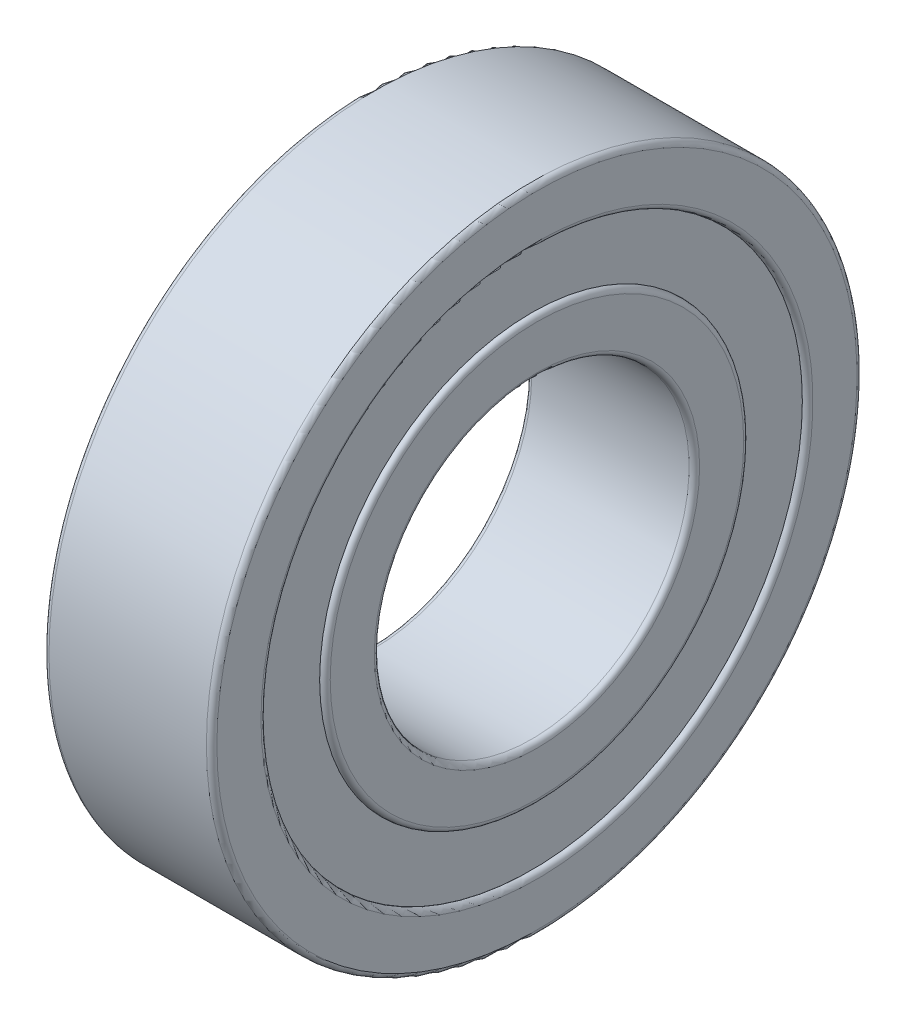
ISO-10303-21;
HEADER;
FILE_DESCRIPTION(('STEP AP214'),'2;1');
FILE_NAME('part.step','',(''),(''),'','','');
FILE_SCHEMA(('AUTOMOTIVE_DESIGN { 1 0 10303 214 1 1 1 1 }'));
ENDSEC;
DATA;
#1=APPLICATION_CONTEXT('core data for automotive mechanical design processes');
#2=APPLICATION_PROTOCOL_DEFINITION('international standard','automotive_design',2000,#1);
#3=PRODUCT_CONTEXT('',#1,'mechanical');
#4=PRODUCT('Part','Part','',(#3));
#5=PRODUCT_RELATED_PRODUCT_CATEGORY('part','',(#4));
#6=PRODUCT_DEFINITION_FORMATION('','',#4);
#7=PRODUCT_DEFINITION_CONTEXT('part definition',#1,'design');
#8=PRODUCT_DEFINITION('design','',#6,#7);
#9=PRODUCT_DEFINITION_SHAPE('','',#8);
#10=(LENGTH_UNIT() NAMED_UNIT(*) SI_UNIT(.MILLI.,.METRE.));
#11=(NAMED_UNIT(*) PLANE_ANGLE_UNIT() SI_UNIT($,.RADIAN.));
#12=(NAMED_UNIT(*) SI_UNIT($,.STERADIAN.) SOLID_ANGLE_UNIT());
#13=UNCERTAINTY_MEASURE_WITH_UNIT(LENGTH_MEASURE(1.E-05),#10,'distance_accuracy_value','');
#14=(GEOMETRIC_REPRESENTATION_CONTEXT(3) GLOBAL_UNCERTAINTY_ASSIGNED_CONTEXT((#13)) GLOBAL_UNIT_ASSIGNED_CONTEXT((#10,
#11,#12)) REPRESENTATION_CONTEXT('',''));
#15=CARTESIAN_POINT('',(0.,0.,0.));
#16=DIRECTION('',(0.,0.,1.));
#17=DIRECTION('',(1.,0.,0.));
#18=AXIS2_PLACEMENT_3D('',#15,#16,#17);
#19=CARTESIAN_POINT('',(0.,0.,0.));
#20=DIRECTION('',(1.,0.,0.));
#21=DIRECTION('',(0.,0.,-1.));
#22=AXIS2_PLACEMENT_3D('',#19,#20,#21);
#23=CYLINDRICAL_SURFACE('',#22,25.79);
#24=CARTESIAN_POINT('',(7.,0.,0.));
#25=DIRECTION('',(1.,0.,0.));
#26=DIRECTION('',(0.,0.,-1.));
#27=AXIS2_PLACEMENT_3D('',#24,#25,#26);
#28=CIRCLE('',#27,25.79);
#29=CARTESIAN_POINT('',(7.,0.,-25.79));
#30=VERTEX_POINT('',#29);
#31=EDGE_CURVE('E11',#30,#30,#28,.T.);
#32=ORIENTED_EDGE('',*,*,#31,.T.);
#33=EDGE_LOOP('',(#32));
#34=FACE_BOUND('',#33,.T.);
#35=CARTESIAN_POINT('',(7.5,0.,0.));
#36=DIRECTION('',(1.,0.,0.));
#37=DIRECTION('',(0.,0.,-1.));
#38=AXIS2_PLACEMENT_3D('',#35,#36,#37);
#39=CIRCLE('',#38,25.79);
#40=CARTESIAN_POINT('',(7.5,0.,-25.79));
#41=VERTEX_POINT('',#40);
#42=EDGE_CURVE('E57',#41,#41,#39,.T.);
#43=ORIENTED_EDGE('',*,*,#42,.F.);
#44=EDGE_LOOP('',(#43));
#45=FACE_BOUND('',#44,.T.);
#46=ADVANCED_FACE('F43',(#34,#45),#23,.T.);
#47=CARTESIAN_POINT('',(7.,25.79,0.));
#48=DIRECTION('',(-1.,0.,0.));
#49=DIRECTION('',(0.,0.,1.));
#50=AXIS2_PLACEMENT_3D('',#47,#48,#49);
#51=PLANE('',#50);
#52=CARTESIAN_POINT('',(7.,0.,0.));
#53=DIRECTION('',(1.,0.,0.));
#54=DIRECTION('',(0.,0.,-1.));
#55=AXIS2_PLACEMENT_3D('',#52,#53,#54);
#56=CIRCLE('',#55,20.21);
#57=CARTESIAN_POINT('',(7.,0.,-20.21));
#58=VERTEX_POINT('',#57);
#59=EDGE_CURVE('E49',#58,#58,#56,.T.);
#60=ORIENTED_EDGE('',*,*,#59,.T.);
#61=EDGE_LOOP('',(#60));
#62=FACE_BOUND('',#61,.T.);
#63=ORIENTED_EDGE('',*,*,#31,.F.);
#64=EDGE_LOOP('',(#63));
#65=FACE_BOUND('',#64,.T.);
#66=ADVANCED_FACE('F67',(#62,#65),#51,.T.);
#67=CARTESIAN_POINT('',(0.,0.,0.));
#68=DIRECTION('',(1.,0.,0.));
#69=DIRECTION('',(0.,0.,-1.));
#70=AXIS2_PLACEMENT_3D('',#67,#68,#69);
#71=CYLINDRICAL_SURFACE('',#70,20.21);
#72=CARTESIAN_POINT('',(7.5,0.,0.));
#73=DIRECTION('',(1.,0.,0.));
#74=DIRECTION('',(0.,0.,-1.));
#75=AXIS2_PLACEMENT_3D('',#72,#73,#74);
#76=CIRCLE('',#75,20.21);
#77=CARTESIAN_POINT('',(7.5,0.,-20.21));
#78=VERTEX_POINT('',#77);
#79=EDGE_CURVE('E53',#78,#78,#76,.T.);
#80=ORIENTED_EDGE('',*,*,#79,.T.);
#81=EDGE_LOOP('',(#80));
#82=FACE_BOUND('',#81,.T.);
#83=ORIENTED_EDGE('',*,*,#59,.F.);
#84=EDGE_LOOP('',(#83));
#85=FACE_BOUND('',#84,.T.);
#86=ADVANCED_FACE('F71',(#82,#85),#71,.F.);
#87=CARTESIAN_POINT('',(7.5,25.79,0.));
#88=DIRECTION('',(1.,0.,0.));
#89=DIRECTION('',(0.,0.,-1.));
#90=AXIS2_PLACEMENT_3D('',#87,#88,#89);
#91=PLANE('',#90);
#92=ORIENTED_EDGE('',*,*,#42,.T.);
#93=EDGE_LOOP('',(#92));
#94=FACE_BOUND('',#93,.T.);
#95=ORIENTED_EDGE('',*,*,#79,.F.);
#96=EDGE_LOOP('',(#95));
#97=FACE_BOUND('',#96,.T.);
#98=ADVANCED_FACE('F63',(#94,#97),#91,.T.);
#99=CLOSED_SHELL('',(#46,#66,#86,#98));
#100=MANIFOLD_SOLID_BREP('B2',#99);
#101=CARTESIAN_POINT('',(-7.5,25.79,0.));
#102=DIRECTION('',(-1.,0.,0.));
#103=DIRECTION('',(0.,0.,1.));
#104=AXIS2_PLACEMENT_3D('',#101,#102,#103);
#105=PLANE('',#104);
#106=CARTESIAN_POINT('',(-7.5,0.,0.));
#107=DIRECTION('',(1.,0.,0.));
#108=DIRECTION('',(0.,0.,-1.));
#109=AXIS2_PLACEMENT_3D('',#106,#107,#108);
#110=CIRCLE('',#109,20.21);
#111=CARTESIAN_POINT('',(-7.5,0.,-20.21));
#112=VERTEX_POINT('',#111);
#113=EDGE_CURVE('E42',#112,#112,#110,.T.);
#114=ORIENTED_EDGE('',*,*,#113,.T.);
#115=EDGE_LOOP('',(#114));
#116=FACE_BOUND('',#115,.T.);
#117=CARTESIAN_POINT('',(-7.5,0.,0.));
#118=DIRECTION('',(1.,0.,0.));
#119=DIRECTION('',(0.,0.,-1.));
#120=AXIS2_PLACEMENT_3D('',#117,#118,#119);
#121=CIRCLE('',#120,25.79);
#122=CARTESIAN_POINT('',(-7.5,0.,-25.79));
#123=VERTEX_POINT('',#122);
#124=EDGE_CURVE('E125',#123,#123,#121,.T.);
#125=ORIENTED_EDGE('',*,*,#124,.F.);
#126=EDGE_LOOP('',(#125));
#127=FACE_BOUND('',#126,.T.);
#128=ADVANCED_FACE('F111',(#116,#127),#105,.T.);
#129=CARTESIAN_POINT('',(0.,0.,0.));
#130=DIRECTION('',(1.,0.,0.));
#131=DIRECTION('',(0.,0.,-1.));
#132=AXIS2_PLACEMENT_3D('',#129,#130,#131);
#133=CYLINDRICAL_SURFACE('',#132,20.21);
#134=CARTESIAN_POINT('',(-7.,0.,0.));
#135=DIRECTION('',(1.,0.,0.));
#136=DIRECTION('',(0.,0.,-1.));
#137=AXIS2_PLACEMENT_3D('',#134,#135,#136);
#138=CIRCLE('',#137,20.21);
#139=CARTESIAN_POINT('',(-7.,0.,-20.21));
#140=VERTEX_POINT('',#139);
#141=EDGE_CURVE('E117',#140,#140,#138,.T.);
#142=ORIENTED_EDGE('',*,*,#141,.T.);
#143=EDGE_LOOP('',(#142));
#144=FACE_BOUND('',#143,.T.);
#145=ORIENTED_EDGE('',*,*,#113,.F.);
#146=EDGE_LOOP('',(#145));
#147=FACE_BOUND('',#146,.T.);
#148=ADVANCED_FACE('F135',(#144,#147),#133,.F.);
#149=CARTESIAN_POINT('',(-7.,25.79,0.));
#150=DIRECTION('',(1.,0.,0.));
#151=DIRECTION('',(0.,0.,-1.));
#152=AXIS2_PLACEMENT_3D('',#149,#150,#151);
#153=PLANE('',#152);
#154=CARTESIAN_POINT('',(-7.,0.,0.));
#155=DIRECTION('',(1.,0.,0.));
#156=DIRECTION('',(0.,0.,-1.));
#157=AXIS2_PLACEMENT_3D('',#154,#155,#156);
#158=CIRCLE('',#157,25.79);
#159=CARTESIAN_POINT('',(-7.,0.,-25.79));
#160=VERTEX_POINT('',#159);
#161=EDGE_CURVE('E121',#160,#160,#158,.T.);
#162=ORIENTED_EDGE('',*,*,#161,.T.);
#163=EDGE_LOOP('',(#162));
#164=FACE_BOUND('',#163,.T.);
#165=ORIENTED_EDGE('',*,*,#141,.F.);
#166=EDGE_LOOP('',(#165));
#167=FACE_BOUND('',#166,.T.);
#168=ADVANCED_FACE('F139',(#164,#167),#153,.T.);
#169=CARTESIAN_POINT('',(0.,0.,0.));
#170=DIRECTION('',(1.,0.,0.));
#171=DIRECTION('',(0.,0.,-1.));
#172=AXIS2_PLACEMENT_3D('',#169,#170,#171);
#173=CYLINDRICAL_SURFACE('',#172,25.79);
#174=ORIENTED_EDGE('',*,*,#124,.T.);
#175=EDGE_LOOP('',(#174));
#176=FACE_BOUND('',#175,.T.);
#177=ORIENTED_EDGE('',*,*,#161,.F.);
#178=EDGE_LOOP('',(#177));
#179=FACE_BOUND('',#178,.T.);
#180=ADVANCED_FACE('F131',(#176,#179),#173,.T.);
#181=CLOSED_SHELL('',(#128,#148,#168,#180));
#182=MANIFOLD_SOLID_BREP('B6',#181);
#183=CARTESIAN_POINT('',(8.,15.,0.));
#184=DIRECTION('',(-1.,0.,0.));
#185=DIRECTION('',(0.,0.,1.));
#186=AXIS2_PLACEMENT_3D('',#183,#184,#185);
#187=PLANE('',#186);
#188=CARTESIAN_POINT('',(8.,0.,0.));
#189=DIRECTION('',(-1.,0.,0.));
#190=DIRECTION('',(0.,0.,1.));
#191=AXIS2_PLACEMENT_3D('',#188,#189,#190);
#192=CIRCLE('',#191,19.7);
#193=CARTESIAN_POINT('',(8.,0.,19.7));
#194=VERTEX_POINT('',#193);
#195=EDGE_CURVE('E221',#194,#194,#192,.F.);
#196=ORIENTED_EDGE('',*,*,#195,.T.);
#197=EDGE_LOOP('',(#196));
#198=FACE_BOUND('',#197,.T.);
#199=CARTESIAN_POINT('',(8.,0.,0.));
#200=DIRECTION('',(-1.,0.,0.));
#201=DIRECTION('',(0.,0.,1.));
#202=AXIS2_PLACEMENT_3D('',#199,#200,#201);
#203=CIRCLE('',#202,15.5);
#204=CARTESIAN_POINT('',(8.,0.,15.5));
#205=VERTEX_POINT('',#204);
#206=EDGE_CURVE('E224',#205,#205,#203,.T.);
#207=ORIENTED_EDGE('',*,*,#206,.T.);
#208=EDGE_LOOP('',(#207));
#209=FACE_BOUND('',#208,.T.);
#210=ADVANCED_FACE('F173',(#198,#209),#187,.F.);
#211=CARTESIAN_POINT('',(-18.6811164230817,0.,0.));
#212=DIRECTION('',(-1.,0.,0.));
#213=DIRECTION('',(0.,0.,1.));
#214=AXIS2_PLACEMENT_3D('',#211,#212,#213);
#215=CYLINDRICAL_SURFACE('',#214,20.2);
#216=CARTESIAN_POINT('',(7.5,0.,0.));
#217=DIRECTION('',(-1.,0.,0.));
#218=DIRECTION('',(0.,0.,1.));
#219=AXIS2_PLACEMENT_3D('',#216,#217,#218);
#220=CIRCLE('',#219,20.2);
#221=CARTESIAN_POINT('',(7.5,0.,20.2));
#222=VERTEX_POINT('',#221);
#223=EDGE_CURVE('E227',#222,#222,#220,.T.);
#224=ORIENTED_EDGE('',*,*,#223,.T.);
#225=EDGE_LOOP('',(#224));
#226=FACE_BOUND('',#225,.T.);
#227=CARTESIAN_POINT('',(5.3179037223327,0.,0.));
#228=DIRECTION('',(-1.,0.,0.));
#229=DIRECTION('',(0.,0.,1.));
#230=AXIS2_PLACEMENT_3D('',#227,#228,#229);
#231=CIRCLE('',#230,20.2);
#232=CARTESIAN_POINT('',(5.3179037223327,0.,20.2));
#233=VERTEX_POINT('',#232);
#234=EDGE_CURVE('E230',#233,#233,#231,.T.);
#235=ORIENTED_EDGE('',*,*,#234,.F.);
#236=EDGE_LOOP('',(#235));
#237=FACE_BOUND('',#236,.T.);
#238=ADVANCED_FACE('F263',(#226,#237),#215,.T.);
#239=CARTESIAN_POINT('',(0.,0.,0.));
#240=DIRECTION('',(-1.,0.,0.));
#241=DIRECTION('',(0.,0.,1.));
#242=AXIS2_PLACEMENT_3D('',#239,#240,#241);
#243=TOROIDAL_SURFACE('',#242,23.,6.01);
#244=CARTESIAN_POINT('',(5.3179037223327,0.,0.));
#245=DIRECTION('',(-1.,0.,0.));
#246=DIRECTION('',(0.,0.,1.));
#247=AXIS2_PLACEMENT_3D('',#244,#245,#246);
#248=CIRCLE('',#247,25.8);
#249=CARTESIAN_POINT('',(5.3179037223327,0.,25.8));
#250=VERTEX_POINT('',#249);
#251=EDGE_CURVE('E233',#250,#250,#248,.T.);
#252=ORIENTED_EDGE('',*,*,#251,.F.);
#253=EDGE_LOOP('',(#252));
#254=FACE_BOUND('',#253,.T.);
#255=ORIENTED_EDGE('',*,*,#234,.T.);
#256=EDGE_LOOP('',(#255));
#257=FACE_BOUND('',#256,.T.);
#258=ADVANCED_FACE('F269',(#254,#257),#243,.T.);
#259=CARTESIAN_POINT('',(-18.6811164230817,0.,0.));
#260=DIRECTION('',(-1.,0.,0.));
#261=DIRECTION('',(0.,0.,1.));
#262=AXIS2_PLACEMENT_3D('',#259,#260,#261);
#263=CYLINDRICAL_SURFACE('',#262,25.8);
#264=CARTESIAN_POINT('',(7.5,0.,0.));
#265=DIRECTION('',(-1.,0.,0.));
#266=DIRECTION('',(0.,0.,1.));
#267=AXIS2_PLACEMENT_3D('',#264,#265,#266);
#268=CIRCLE('',#267,25.8);
#269=CARTESIAN_POINT('',(7.5,0.,25.8));
#270=VERTEX_POINT('',#269);
#271=EDGE_CURVE('E212',#270,#270,#268,.F.);
#272=ORIENTED_EDGE('',*,*,#271,.T.);
#273=EDGE_LOOP('',(#272));
#274=FACE_BOUND('',#273,.T.);
#275=ORIENTED_EDGE('',*,*,#251,.T.);
#276=EDGE_LOOP('',(#275));
#277=FACE_BOUND('',#276,.T.);
#278=ADVANCED_FACE('F311',(#274,#277),#263,.F.);
#279=CARTESIAN_POINT('',(8.,25.8,0.));
#280=DIRECTION('',(-1.,0.,0.));
#281=DIRECTION('',(0.,0.,1.));
#282=AXIS2_PLACEMENT_3D('',#279,#280,#281);
#283=PLANE('',#282);
#284=CARTESIAN_POINT('',(8.,0.,0.));
#285=DIRECTION('',(-1.,0.,0.));
#286=DIRECTION('',(0.,0.,1.));
#287=AXIS2_PLACEMENT_3D('',#284,#285,#286);
#288=CIRCLE('',#287,26.3);
#289=CARTESIAN_POINT('',(8.,0.,26.3));
#290=VERTEX_POINT('',#289);
#291=EDGE_CURVE('E215',#290,#290,#288,.T.);
#292=ORIENTED_EDGE('',*,*,#291,.T.);
#293=EDGE_LOOP('',(#292));
#294=FACE_BOUND('',#293,.T.);
#295=CARTESIAN_POINT('',(8.,0.,0.));
#296=DIRECTION('',(-1.,0.,0.));
#297=DIRECTION('',(0.,0.,1.));
#298=AXIS2_PLACEMENT_3D('',#295,#296,#297);
#299=CIRCLE('',#298,30.5);
#300=CARTESIAN_POINT('',(8.,0.,30.5));
#301=VERTEX_POINT('',#300);
#302=EDGE_CURVE('E218',#301,#301,#299,.F.);
#303=ORIENTED_EDGE('',*,*,#302,.T.);
#304=EDGE_LOOP('',(#303));
#305=FACE_BOUND('',#304,.T.);
#306=ADVANCED_FACE('F309',(#294,#305),#283,.F.);
#307=CARTESIAN_POINT('',(-18.6811164230817,0.,0.));
#308=DIRECTION('',(-1.,0.,0.));
#309=DIRECTION('',(0.,0.,1.));
#310=AXIS2_PLACEMENT_3D('',#307,#308,#309);
#311=CYLINDRICAL_SURFACE('',#310,31.);
#312=CARTESIAN_POINT('',(-7.5,0.,0.));
#313=DIRECTION('',(1.,0.,0.));
#314=DIRECTION('',(0.,0.,-1.));
#315=AXIS2_PLACEMENT_3D('',#312,#313,#314);
#316=CIRCLE('',#315,31.);
#317=CARTESIAN_POINT('',(-7.5,0.,-31.));
#318=VERTEX_POINT('',#317);
#319=EDGE_CURVE('E110',#318,#318,#316,.T.);
#320=ORIENTED_EDGE('',*,*,#319,.T.);
#321=EDGE_LOOP('',(#320));
#322=FACE_BOUND('',#321,.T.);
#323=CARTESIAN_POINT('',(7.5,0.,0.));
#324=DIRECTION('',(-1.,0.,0.));
#325=DIRECTION('',(0.,0.,1.));
#326=AXIS2_PLACEMENT_3D('',#323,#324,#325);
#327=CIRCLE('',#326,31.);
#328=CARTESIAN_POINT('',(7.5,0.,31.));
#329=VERTEX_POINT('',#328);
#330=EDGE_CURVE('E181',#329,#329,#327,.T.);
#331=ORIENTED_EDGE('',*,*,#330,.T.);
#332=EDGE_LOOP('',(#331));
#333=FACE_BOUND('',#332,.T.);
#334=ADVANCED_FACE('F259',(#322,#333),#311,.T.);
#335=CARTESIAN_POINT('',(-8.,31.,0.));
#336=DIRECTION('',(1.,0.,0.));
#337=DIRECTION('',(0.,0.,-1.));
#338=AXIS2_PLACEMENT_3D('',#335,#336,#337);
#339=PLANE('',#338);
#340=CARTESIAN_POINT('',(-8.,0.,0.));
#341=DIRECTION('',(1.,0.,0.));
#342=DIRECTION('',(0.,0.,-1.));
#343=AXIS2_PLACEMENT_3D('',#340,#341,#342);
#344=CIRCLE('',#343,26.3);
#345=CARTESIAN_POINT('',(-8.,0.,-26.3));
#346=VERTEX_POINT('',#345);
#347=EDGE_CURVE('E203',#346,#346,#344,.T.);
#348=ORIENTED_EDGE('',*,*,#347,.T.);
#349=EDGE_LOOP('',(#348));
#350=FACE_BOUND('',#349,.T.);
#351=CARTESIAN_POINT('',(-8.,0.,0.));
#352=DIRECTION('',(1.,0.,0.));
#353=DIRECTION('',(0.,0.,-1.));
#354=AXIS2_PLACEMENT_3D('',#351,#352,#353);
#355=CIRCLE('',#354,30.5);
#356=CARTESIAN_POINT('',(-8.,0.,-30.5));
#357=VERTEX_POINT('',#356);
#358=EDGE_CURVE('E206',#357,#357,#355,.F.);
#359=ORIENTED_EDGE('',*,*,#358,.T.);
#360=EDGE_LOOP('',(#359));
#361=FACE_BOUND('',#360,.T.);
#362=ADVANCED_FACE('F253',(#350,#361),#339,.F.);
#363=CARTESIAN_POINT('',(-18.6811164230817,0.,0.));
#364=DIRECTION('',(-1.,0.,0.));
#365=DIRECTION('',(0.,0.,1.));
#366=AXIS2_PLACEMENT_3D('',#363,#364,#365);
#367=CYLINDRICAL_SURFACE('',#366,25.8);
#368=CARTESIAN_POINT('',(-7.5,0.,0.));
#369=DIRECTION('',(1.,0.,0.));
#370=DIRECTION('',(0.,0.,-1.));
#371=AXIS2_PLACEMENT_3D('',#368,#369,#370);
#372=CIRCLE('',#371,25.8);
#373=CARTESIAN_POINT('',(-7.5,0.,-25.8));
#374=VERTEX_POINT('',#373);
#375=EDGE_CURVE('E209',#374,#374,#372,.F.);
#376=ORIENTED_EDGE('',*,*,#375,.T.);
#377=EDGE_LOOP('',(#376));
#378=FACE_BOUND('',#377,.T.);
#379=CARTESIAN_POINT('',(-5.3179037223327,0.,0.));
#380=DIRECTION('',(-1.,0.,0.));
#381=DIRECTION('',(0.,0.,1.));
#382=AXIS2_PLACEMENT_3D('',#379,#380,#381);
#383=CIRCLE('',#382,25.8);
#384=CARTESIAN_POINT('',(-5.3179037223327,0.,25.8));
#385=VERTEX_POINT('',#384);
#386=EDGE_CURVE('E236',#385,#385,#383,.T.);
#387=ORIENTED_EDGE('',*,*,#386,.F.);
#388=EDGE_LOOP('',(#387));
#389=FACE_BOUND('',#388,.T.);
#390=ADVANCED_FACE('F248',(#378,#389),#367,.F.);
#391=CARTESIAN_POINT('',(0.,0.,0.));
#392=DIRECTION('',(-1.,0.,0.));
#393=DIRECTION('',(0.,0.,1.));
#394=AXIS2_PLACEMENT_3D('',#391,#392,#393);
#395=TOROIDAL_SURFACE('',#394,23.,6.01);
#396=CARTESIAN_POINT('',(-5.3179037223327,0.,0.));
#397=DIRECTION('',(-1.,0.,0.));
#398=DIRECTION('',(0.,0.,1.));
#399=AXIS2_PLACEMENT_3D('',#396,#397,#398);
#400=CIRCLE('',#399,20.2);
#401=CARTESIAN_POINT('',(-5.3179037223327,0.,20.2));
#402=VERTEX_POINT('',#401);
#403=EDGE_CURVE('E239',#402,#402,#400,.T.);
#404=ORIENTED_EDGE('',*,*,#403,.F.);
#405=EDGE_LOOP('',(#404));
#406=FACE_BOUND('',#405,.T.);
#407=ORIENTED_EDGE('',*,*,#386,.T.);
#408=EDGE_LOOP('',(#407));
#409=FACE_BOUND('',#408,.T.);
#410=ADVANCED_FACE('F245',(#406,#409),#395,.T.);
#411=CARTESIAN_POINT('',(-18.6811164230817,0.,0.));
#412=DIRECTION('',(-1.,0.,0.));
#413=DIRECTION('',(0.,0.,1.));
#414=AXIS2_PLACEMENT_3D('',#411,#412,#413);
#415=CYLINDRICAL_SURFACE('',#414,20.2);
#416=CARTESIAN_POINT('',(-7.5,0.,0.));
#417=DIRECTION('',(1.,0.,0.));
#418=DIRECTION('',(0.,0.,-1.));
#419=AXIS2_PLACEMENT_3D('',#416,#417,#418);
#420=CIRCLE('',#419,20.2);
#421=CARTESIAN_POINT('',(-7.5,0.,-20.2));
#422=VERTEX_POINT('',#421);
#423=EDGE_CURVE('E185',#422,#422,#420,.T.);
#424=ORIENTED_EDGE('',*,*,#423,.T.);
#425=EDGE_LOOP('',(#424));
#426=FACE_BOUND('',#425,.T.);
#427=ORIENTED_EDGE('',*,*,#403,.T.);
#428=EDGE_LOOP('',(#427));
#429=FACE_BOUND('',#428,.T.);
#430=ADVANCED_FACE('F243',(#426,#429),#415,.T.);
#431=CARTESIAN_POINT('',(-8.,20.2,0.));
#432=DIRECTION('',(1.,0.,0.));
#433=DIRECTION('',(0.,0.,-1.));
#434=AXIS2_PLACEMENT_3D('',#431,#432,#433);
#435=PLANE('',#434);
#436=CARTESIAN_POINT('',(-8.,0.,0.));
#437=DIRECTION('',(1.,0.,0.));
#438=DIRECTION('',(0.,0.,-1.));
#439=AXIS2_PLACEMENT_3D('',#436,#437,#438);
#440=CIRCLE('',#439,15.5);
#441=CARTESIAN_POINT('',(-8.,0.,-15.5));
#442=VERTEX_POINT('',#441);
#443=EDGE_CURVE('E189',#442,#442,#440,.T.);
#444=ORIENTED_EDGE('',*,*,#443,.T.);
#445=EDGE_LOOP('',(#444));
#446=FACE_BOUND('',#445,.T.);
#447=CARTESIAN_POINT('',(-8.,0.,0.));
#448=DIRECTION('',(1.,0.,0.));
#449=DIRECTION('',(0.,0.,-1.));
#450=AXIS2_PLACEMENT_3D('',#447,#448,#449);
#451=CIRCLE('',#450,19.7);
#452=CARTESIAN_POINT('',(-8.,0.,-19.7));
#453=VERTEX_POINT('',#452);
#454=EDGE_CURVE('E194',#453,#453,#451,.F.);
#455=ORIENTED_EDGE('',*,*,#454,.T.);
#456=EDGE_LOOP('',(#455));
#457=FACE_BOUND('',#456,.T.);
#458=ADVANCED_FACE('F370',(#446,#457),#435,.F.);
#459=CARTESIAN_POINT('',(-18.6811164230817,0.,0.));
#460=DIRECTION('',(-1.,0.,0.));
#461=DIRECTION('',(0.,0.,1.));
#462=AXIS2_PLACEMENT_3D('',#459,#460,#461);
#463=CYLINDRICAL_SURFACE('',#462,15.);
#464=CARTESIAN_POINT('',(-7.5,0.,0.));
#465=DIRECTION('',(1.,0.,0.));
#466=DIRECTION('',(0.,0.,-1.));
#467=AXIS2_PLACEMENT_3D('',#464,#465,#466);
#468=CIRCLE('',#467,15.);
#469=CARTESIAN_POINT('',(-7.5,0.,-15.));
#470=VERTEX_POINT('',#469);
#471=EDGE_CURVE('E197',#470,#470,#468,.F.);
#472=ORIENTED_EDGE('',*,*,#471,.T.);
#473=EDGE_LOOP('',(#472));
#474=FACE_BOUND('',#473,.T.);
#475=CARTESIAN_POINT('',(7.5,0.,0.));
#476=DIRECTION('',(-1.,0.,0.));
#477=DIRECTION('',(0.,0.,1.));
#478=AXIS2_PLACEMENT_3D('',#475,#476,#477);
#479=CIRCLE('',#478,15.);
#480=CARTESIAN_POINT('',(7.5,0.,15.));
#481=VERTEX_POINT('',#480);
#482=EDGE_CURVE('E200',#481,#481,#479,.F.);
#483=ORIENTED_EDGE('',*,*,#482,.T.);
#484=EDGE_LOOP('',(#483));
#485=FACE_BOUND('',#484,.T.);
#486=ADVANCED_FACE('F279',(#474,#485),#463,.F.);
#487=CARTESIAN_POINT('',(7.5,0.,0.));
#488=DIRECTION('',(-1.,0.,0.));
#489=DIRECTION('',(0.,0.,1.));
#490=AXIS2_PLACEMENT_3D('',#487,#488,#489);
#491=TOROIDAL_SURFACE('',#490,19.7,0.5);
#492=ORIENTED_EDGE('',*,*,#195,.F.);
#493=EDGE_LOOP('',(#492));
#494=FACE_BOUND('',#493,.T.);
#495=ORIENTED_EDGE('',*,*,#223,.F.);
#496=EDGE_LOOP('',(#495));
#497=FACE_BOUND('',#496,.T.);
#498=ADVANCED_FACE('F275',(#494,#497),#491,.T.);
#499=CARTESIAN_POINT('',(7.5,0.,0.));
#500=DIRECTION('',(-1.,0.,0.));
#501=DIRECTION('',(0.,0.,1.));
#502=AXIS2_PLACEMENT_3D('',#499,#500,#501);
#503=TOROIDAL_SURFACE('',#502,26.3,0.5);
#504=ORIENTED_EDGE('',*,*,#271,.F.);
#505=EDGE_LOOP('',(#504));
#506=FACE_BOUND('',#505,.T.);
#507=ORIENTED_EDGE('',*,*,#291,.F.);
#508=EDGE_LOOP('',(#507));
#509=FACE_BOUND('',#508,.T.);
#510=ADVANCED_FACE('F278',(#506,#509),#503,.T.);
#511=CARTESIAN_POINT('',(-7.5,0.,0.));
#512=DIRECTION('',(1.,0.,0.));
#513=DIRECTION('',(0.,0.,-1.));
#514=AXIS2_PLACEMENT_3D('',#511,#512,#513);
#515=TOROIDAL_SURFACE('',#514,26.3,0.5);
#516=ORIENTED_EDGE('',*,*,#347,.F.);
#517=EDGE_LOOP('',(#516));
#518=FACE_BOUND('',#517,.T.);
#519=ORIENTED_EDGE('',*,*,#375,.F.);
#520=EDGE_LOOP('',(#519));
#521=FACE_BOUND('',#520,.T.);
#522=ADVANCED_FACE('F283',(#518,#521),#515,.T.);
#523=CARTESIAN_POINT('',(-7.5,0.,0.));
#524=DIRECTION('',(1.,0.,0.));
#525=DIRECTION('',(0.,0.,-1.));
#526=AXIS2_PLACEMENT_3D('',#523,#524,#525);
#527=TOROIDAL_SURFACE('',#526,15.5,0.5);
#528=ORIENTED_EDGE('',*,*,#443,.F.);
#529=EDGE_LOOP('',(#528));
#530=FACE_BOUND('',#529,.T.);
#531=ORIENTED_EDGE('',*,*,#471,.F.);
#532=EDGE_LOOP('',(#531));
#533=FACE_BOUND('',#532,.T.);
#534=ADVANCED_FACE('F287',(#530,#533),#527,.T.);
#535=CARTESIAN_POINT('',(-7.5,0.,0.));
#536=DIRECTION('',(1.,0.,0.));
#537=DIRECTION('',(0.,0.,-1.));
#538=AXIS2_PLACEMENT_3D('',#535,#536,#537);
#539=TOROIDAL_SURFACE('',#538,19.7,0.5);
#540=ORIENTED_EDGE('',*,*,#423,.F.);
#541=EDGE_LOOP('',(#540));
#542=FACE_BOUND('',#541,.T.);
#543=ORIENTED_EDGE('',*,*,#454,.F.);
#544=EDGE_LOOP('',(#543));
#545=FACE_BOUND('',#544,.T.);
#546=ADVANCED_FACE('F291',(#542,#545),#539,.T.);
#547=CARTESIAN_POINT('',(-7.5,0.,0.));
#548=DIRECTION('',(1.,0.,0.));
#549=DIRECTION('',(0.,0.,-1.));
#550=AXIS2_PLACEMENT_3D('',#547,#548,#549);
#551=TOROIDAL_SURFACE('',#550,30.5,0.5);
#552=ORIENTED_EDGE('',*,*,#319,.F.);
#553=EDGE_LOOP('',(#552));
#554=FACE_BOUND('',#553,.T.);
#555=ORIENTED_EDGE('',*,*,#358,.F.);
#556=EDGE_LOOP('',(#555));
#557=FACE_BOUND('',#556,.T.);
#558=ADVANCED_FACE('F295',(#554,#557),#551,.T.);
#559=CARTESIAN_POINT('',(7.5,0.,0.));
#560=DIRECTION('',(-1.,0.,0.));
#561=DIRECTION('',(0.,0.,1.));
#562=AXIS2_PLACEMENT_3D('',#559,#560,#561);
#563=TOROIDAL_SURFACE('',#562,30.5,0.5);
#564=ORIENTED_EDGE('',*,*,#302,.F.);
#565=EDGE_LOOP('',(#564));
#566=FACE_BOUND('',#565,.T.);
#567=ORIENTED_EDGE('',*,*,#330,.F.);
#568=EDGE_LOOP('',(#567));
#569=FACE_BOUND('',#568,.T.);
#570=ADVANCED_FACE('F298',(#566,#569),#563,.T.);
#571=CARTESIAN_POINT('',(7.5,0.,0.));
#572=DIRECTION('',(-1.,0.,0.));
#573=DIRECTION('',(0.,0.,1.));
#574=AXIS2_PLACEMENT_3D('',#571,#572,#573);
#575=TOROIDAL_SURFACE('',#574,15.5,0.5);
#576=ORIENTED_EDGE('',*,*,#482,.F.);
#577=EDGE_LOOP('',(#576));
#578=FACE_BOUND('',#577,.T.);
#579=ORIENTED_EDGE('',*,*,#206,.F.);
#580=EDGE_LOOP('',(#579));
#581=FACE_BOUND('',#580,.T.);
#582=ADVANCED_FACE('F175',(#578,#581),#575,.T.);
#583=CLOSED_SHELL('',(#210,#238,#258,#278,#306,#334,#362,#390,#410,#430,#458,#486,#498,#510,
#522,#534,#546,#558,#570,#582));
#584=CARTESIAN_POINT('',(0.,0.,0.));
#585=DIRECTION('',(-1.,0.,0.));
#586=DIRECTION('',(0.,0.,1.));
#587=AXIS2_PLACEMENT_3D('',#584,#585,#586);
#588=TOROIDAL_SURFACE('',#587,23.,6.);
#589=CARTESIAN_POINT('',(0.,0.,29.));
#590=VERTEX_POINT('',#589);
#591=VERTEX_LOOP('',#590);
#592=FACE_BOUND('',#591,.T.);
#593=ADVANCED_FACE('F459',(#592),#588,.F.);
#594=CLOSED_SHELL('',(#593));
#595=ORIENTED_CLOSED_SHELL('',*,#594,.T.);
#596=BREP_WITH_VOIDS('B37',#583,(#595));
#597=ADVANCED_BREP_SHAPE_REPRESENTATION('',(#18,#100,#182,#596),#14);
#598=SHAPE_DEFINITION_REPRESENTATION(#9,#597);
ENDSEC;
END-ISO-10303-21;
